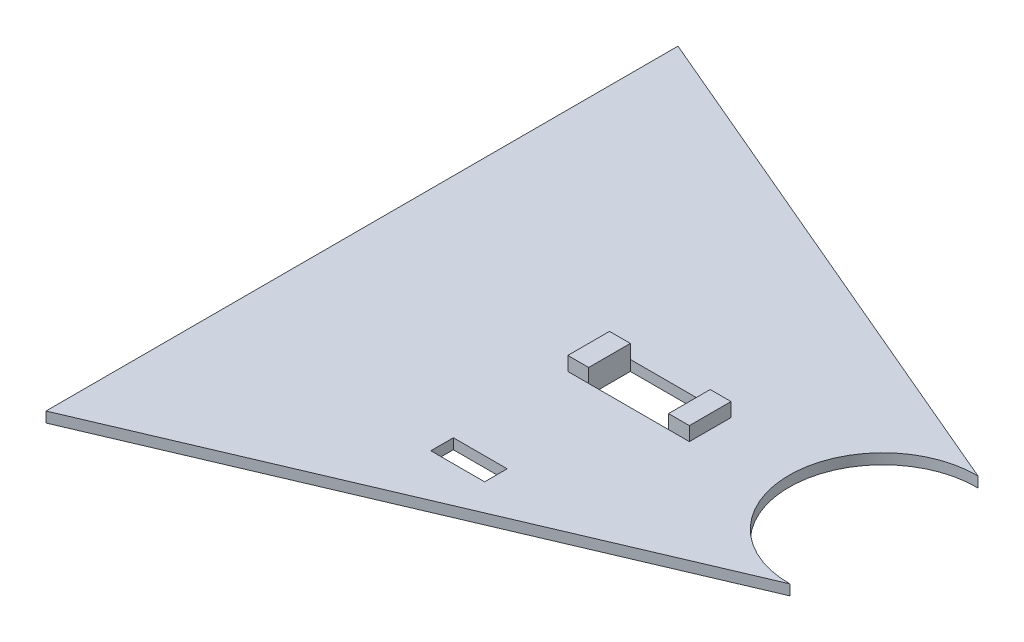
ISO-10303-21;
HEADER;
FILE_DESCRIPTION(('STEP AP214'),'2;1');
FILE_NAME('part.step','',(''),(''),'','','');
FILE_SCHEMA(('AUTOMOTIVE_DESIGN { 1 0 10303 214 1 1 1 1 }'));
ENDSEC;
DATA;
#1=APPLICATION_CONTEXT('core data for automotive mechanical design processes');
#2=APPLICATION_PROTOCOL_DEFINITION('international standard','automotive_design',2000,#1);
#3=PRODUCT_CONTEXT('',#1,'mechanical');
#4=PRODUCT('Part','Part','',(#3));
#5=PRODUCT_RELATED_PRODUCT_CATEGORY('part','',(#4));
#6=PRODUCT_DEFINITION_FORMATION('','',#4);
#7=PRODUCT_DEFINITION_CONTEXT('part definition',#1,'design');
#8=PRODUCT_DEFINITION('design','',#6,#7);
#9=PRODUCT_DEFINITION_SHAPE('','',#8);
#10=(LENGTH_UNIT() NAMED_UNIT(*) SI_UNIT(.MILLI.,.METRE.));
#11=(NAMED_UNIT(*) PLANE_ANGLE_UNIT() SI_UNIT($,.RADIAN.));
#12=(NAMED_UNIT(*) SI_UNIT($,.STERADIAN.) SOLID_ANGLE_UNIT());
#13=UNCERTAINTY_MEASURE_WITH_UNIT(LENGTH_MEASURE(1.E-05),#10,'distance_accuracy_value','');
#14=(GEOMETRIC_REPRESENTATION_CONTEXT(3) GLOBAL_UNCERTAINTY_ASSIGNED_CONTEXT((#13)) GLOBAL_UNIT_ASSIGNED_CONTEXT((#10,
#11,#12)) REPRESENTATION_CONTEXT('',''));
#15=CARTESIAN_POINT('',(0.,0.,0.));
#16=DIRECTION('',(0.,0.,1.));
#17=DIRECTION('',(1.,0.,0.));
#18=AXIS2_PLACEMENT_3D('',#15,#16,#17);
#19=CARTESIAN_POINT('',(150.,3.,0.));
#20=DIRECTION('',(0.,1.,0.));
#21=DIRECTION('',(0.,0.,1.));
#22=AXIS2_PLACEMENT_3D('',#19,#20,#21);
#23=PLANE('',#22);
#24=DIRECTION('',(0.,0.,1.));
#25=VECTOR('',#24,1.);
#26=CARTESIAN_POINT('',(65.3229716110229,3.,39.0075578283953));
#27=LINE('',#26,#25);
#28=CARTESIAN_POINT('',(65.3229716110229,3.,39.0075578283953));
#29=VERTEX_POINT('',#28);
#30=CARTESIAN_POINT('',(65.3229716110229,3.,45.5075578283953));
#31=VERTEX_POINT('',#30);
#32=EDGE_CURVE('E280',#29,#31,#27,.T.);
#33=ORIENTED_EDGE('',*,*,#32,.F.);
#34=DIRECTION('',(-1.,0.,0.));
#35=VECTOR('',#34,1.);
#36=CARTESIAN_POINT('',(65.3229716110229,3.,39.0075578283953));
#37=LINE('',#36,#35);
#38=CARTESIAN_POINT('',(80.823791534097,3.,39.0075578283953));
#39=VERTEX_POINT('',#38);
#40=EDGE_CURVE('E292',#39,#29,#37,.T.);
#41=ORIENTED_EDGE('',*,*,#40,.F.);
#42=DIRECTION('',(0.,0.,-1.));
#43=VECTOR('',#42,1.);
#44=CARTESIAN_POINT('',(80.823791534097,3.,39.0075578283953));
#45=LINE('',#44,#43);
#46=CARTESIAN_POINT('',(80.823791534097,3.,45.5075578283953));
#47=VERTEX_POINT('',#46);
#48=EDGE_CURVE('E311',#47,#39,#45,.T.);
#49=ORIENTED_EDGE('',*,*,#48,.F.);
#50=DIRECTION('',(1.,0.,0.));
#51=VECTOR('',#50,1.);
#52=CARTESIAN_POINT('',(65.3229716110229,3.,45.5075578283953));
#53=LINE('',#52,#51);
#54=EDGE_CURVE('E307',#31,#47,#53,.T.);
#55=ORIENTED_EDGE('',*,*,#54,.F.);
#56=EDGE_LOOP('',(#33,#41,#49,#55));
#57=FACE_BOUND('',#56,.T.);
#58=DIRECTION('',(0.919983270683584,0.,-0.391957627381245));
#59=VECTOR('',#58,1.);
#60=CARTESIAN_POINT('',(0.,3.,91.));
#61=LINE('',#60,#59);
#62=CARTESIAN_POINT('',(0.,3.,91.));
#63=VERTEX_POINT('',#62);
#64=CARTESIAN_POINT('',(150.219685615905,3.,26.9991062487291));
#65=VERTEX_POINT('',#64);
#66=EDGE_CURVE('E331',#63,#65,#61,.T.);
#67=ORIENTED_EDGE('',*,*,#66,.T.);
#68=CARTESIAN_POINT('',(150.,3.,0.));
#69=DIRECTION('',(0.,-1.,0.));
#70=DIRECTION('',(0.,0.,1.));
#71=AXIS2_PLACEMENT_3D('',#68,#69,#70);
#72=CIRCLE('',#71,27.);
#73=CARTESIAN_POINT('',(150.405230156953,3.,-26.9969588753973));
#74=VERTEX_POINT('',#73);
#75=EDGE_CURVE('E335',#65,#74,#72,.T.);
#76=ORIENTED_EDGE('',*,*,#75,.T.);
#77=DIRECTION('',(-0.92015283803749,0.,-0.391559388409411));
#78=VECTOR('',#77,1.);
#79=CARTESIAN_POINT('',(0.,3.,-91.));
#80=LINE('',#79,#78);
#81=CARTESIAN_POINT('',(0.,3.,-91.));
#82=VERTEX_POINT('',#81);
#83=EDGE_CURVE('E339',#74,#82,#80,.T.);
#84=ORIENTED_EDGE('',*,*,#83,.T.);
#85=DIRECTION('',(0.,0.,1.));
#86=VECTOR('',#85,1.);
#87=CARTESIAN_POINT('',(0.,3.,91.));
#88=LINE('',#87,#86);
#89=EDGE_CURVE('E342',#82,#63,#88,.T.);
#90=ORIENTED_EDGE('',*,*,#89,.T.);
#91=EDGE_LOOP('',(#67,#76,#84,#90));
#92=FACE_BOUND('',#91,.T.);
#93=DIRECTION('',(0.,0.,1.));
#94=VECTOR('',#93,1.);
#95=CARTESIAN_POINT('',(100.280547291491,3.,-6.));
#96=LINE('',#95,#94);
#97=CARTESIAN_POINT('',(100.280547291491,3.,-6.));
#98=VERTEX_POINT('',#97);
#99=CARTESIAN_POINT('',(100.280547291491,3.,6.));
#100=VERTEX_POINT('',#99);
#101=EDGE_CURVE('E55',#98,#100,#96,.T.);
#102=ORIENTED_EDGE('',*,*,#101,.T.);
#103=DIRECTION('',(1.,0.,0.));
#104=VECTOR('',#103,1.);
#105=CARTESIAN_POINT('',(94.280547291491,3.,6.));
#106=LINE('',#105,#104);
#107=CARTESIAN_POINT('',(94.280547291491,3.,6.));
#108=VERTEX_POINT('',#107);
#109=EDGE_CURVE('E192',#108,#100,#106,.T.);
#110=ORIENTED_EDGE('',*,*,#109,.F.);
#111=DIRECTION('',(1.,0.,0.));
#112=VECTOR('',#111,1.);
#113=CARTESIAN_POINT('',(71.280547291491,3.,6.));
#114=LINE('',#113,#112);
#115=CARTESIAN_POINT('',(71.280547291491,3.,6.));
#116=VERTEX_POINT('',#115);
#117=EDGE_CURVE('E183',#116,#108,#114,.T.);
#118=ORIENTED_EDGE('',*,*,#117,.F.);
#119=DIRECTION('',(-1.,0.,0.));
#120=VECTOR('',#119,1.);
#121=CARTESIAN_POINT('',(71.280547291491,3.,6.));
#122=LINE('',#121,#120);
#123=CARTESIAN_POINT('',(65.280547291491,3.,6.));
#124=VERTEX_POINT('',#123);
#125=EDGE_CURVE('E196',#116,#124,#122,.T.);
#126=ORIENTED_EDGE('',*,*,#125,.T.);
#127=DIRECTION('',(0.,0.,1.));
#128=VECTOR('',#127,1.);
#129=CARTESIAN_POINT('',(65.280547291491,3.,-6.));
#130=LINE('',#129,#128);
#131=CARTESIAN_POINT('',(65.280547291491,3.,-6.));
#132=VERTEX_POINT('',#131);
#133=EDGE_CURVE('E244',#132,#124,#130,.T.);
#134=ORIENTED_EDGE('',*,*,#133,.F.);
#135=DIRECTION('',(-1.,0.,0.));
#136=VECTOR('',#135,1.);
#137=CARTESIAN_POINT('',(71.280547291491,3.,-6.));
#138=LINE('',#137,#136);
#139=CARTESIAN_POINT('',(71.280547291491,3.,-6.));
#140=VERTEX_POINT('',#139);
#141=EDGE_CURVE('E231',#140,#132,#138,.T.);
#142=ORIENTED_EDGE('',*,*,#141,.F.);
#143=DIRECTION('',(1.,0.,0.));
#144=VECTOR('',#143,1.);
#145=CARTESIAN_POINT('',(71.280547291491,3.,-6.));
#146=LINE('',#145,#144);
#147=CARTESIAN_POINT('',(94.280547291491,3.,-6.));
#148=VERTEX_POINT('',#147);
#149=EDGE_CURVE('E188',#140,#148,#146,.T.);
#150=ORIENTED_EDGE('',*,*,#149,.T.);
#151=DIRECTION('',(1.,0.,0.));
#152=VECTOR('',#151,1.);
#153=CARTESIAN_POINT('',(94.280547291491,3.,-6.));
#154=LINE('',#153,#152);
#155=EDGE_CURVE('E60',#148,#98,#154,.T.);
#156=ORIENTED_EDGE('',*,*,#155,.T.);
#157=EDGE_LOOP('',(#102,#110,#118,#126,#134,#142,#150,#156));
#158=FACE_BOUND('',#157,.T.);
#159=ADVANCED_FACE('F39',(#57,#92,#158),#23,.T.);
#160=CARTESIAN_POINT('',(0.,3.,91.));
#161=DIRECTION('',(-0.391957627381245,0.,-0.919983270683584));
#162=DIRECTION('',(-0.919983270683584,0.,0.391957627381245));
#163=AXIS2_PLACEMENT_3D('',#160,#161,#162);
#164=PLANE('',#163);
#165=DIRECTION('',(0.919983270683584,0.,-0.391957627381245));
#166=VECTOR('',#165,1.);
#167=CARTESIAN_POINT('',(0.,0.,91.));
#168=LINE('',#167,#166);
#169=CARTESIAN_POINT('',(0.,0.,91.));
#170=VERTEX_POINT('',#169);
#171=CARTESIAN_POINT('',(150.219685615905,0.,26.9991062487291));
#172=VERTEX_POINT('',#171);
#173=EDGE_CURVE('E321',#170,#172,#168,.T.);
#174=ORIENTED_EDGE('',*,*,#173,.T.);
#175=DIRECTION('',(0.,-1.,0.));
#176=VECTOR('',#175,1.);
#177=CARTESIAN_POINT('',(150.219685615905,3.,26.9991062487291));
#178=LINE('',#177,#176);
#179=EDGE_CURVE('E11',#65,#172,#178,.T.);
#180=ORIENTED_EDGE('',*,*,#179,.F.);
#181=ORIENTED_EDGE('',*,*,#66,.F.);
#182=DIRECTION('',(0.,-1.,0.));
#183=VECTOR('',#182,1.);
#184=CARTESIAN_POINT('',(0.,3.,91.));
#185=LINE('',#184,#183);
#186=EDGE_CURVE('E345',#63,#170,#185,.T.);
#187=ORIENTED_EDGE('',*,*,#186,.T.);
#188=EDGE_LOOP('',(#174,#180,#181,#187));
#189=FACE_BOUND('',#188,.T.);
#190=ADVANCED_FACE('F41',(#189),#164,.F.);
#191=CARTESIAN_POINT('',(150.,3.,0.));
#192=DIRECTION('',(0.,-1.,0.));
#193=DIRECTION('',(0.,0.,-1.));
#194=AXIS2_PLACEMENT_3D('',#191,#192,#193);
#195=CYLINDRICAL_SURFACE('',#194,27.);
#196=CARTESIAN_POINT('',(150.,0.,0.));
#197=DIRECTION('',(0.,-1.,0.));
#198=DIRECTION('',(0.,0.,1.));
#199=AXIS2_PLACEMENT_3D('',#196,#197,#198);
#200=CIRCLE('',#199,27.);
#201=CARTESIAN_POINT('',(150.405230156953,0.,-26.9969588753973));
#202=VERTEX_POINT('',#201);
#203=EDGE_CURVE('E349',#172,#202,#200,.T.);
#204=ORIENTED_EDGE('',*,*,#203,.T.);
#205=DIRECTION('',(0.,-1.,0.));
#206=VECTOR('',#205,1.);
#207=CARTESIAN_POINT('',(150.405230156953,3.,-26.9969588753973));
#208=LINE('',#207,#206);
#209=EDGE_CURVE('E48',#74,#202,#208,.T.);
#210=ORIENTED_EDGE('',*,*,#209,.F.);
#211=ORIENTED_EDGE('',*,*,#75,.F.);
#212=ORIENTED_EDGE('',*,*,#179,.T.);
#213=EDGE_LOOP('',(#204,#210,#211,#212));
#214=FACE_BOUND('',#213,.T.);
#215=ADVANCED_FACE('F384',(#214),#195,.F.);
#216=CARTESIAN_POINT('',(0.,3.,-91.));
#217=DIRECTION('',(-0.391559388409411,0.,0.92015283803749));
#218=DIRECTION('',(0.920152838037491,0.,0.391559388409411));
#219=AXIS2_PLACEMENT_3D('',#216,#217,#218);
#220=PLANE('',#219);
#221=DIRECTION('',(-0.92015283803749,0.,-0.391559388409411));
#222=VECTOR('',#221,1.);
#223=CARTESIAN_POINT('',(0.,0.,-91.));
#224=LINE('',#223,#222);
#225=CARTESIAN_POINT('',(0.,0.,-91.));
#226=VERTEX_POINT('',#225);
#227=EDGE_CURVE('E352',#202,#226,#224,.T.);
#228=ORIENTED_EDGE('',*,*,#227,.T.);
#229=DIRECTION('',(0.,-1.,0.));
#230=VECTOR('',#229,1.);
#231=CARTESIAN_POINT('',(0.,3.,-91.));
#232=LINE('',#231,#230);
#233=EDGE_CURVE('E360',#82,#226,#232,.T.);
#234=ORIENTED_EDGE('',*,*,#233,.F.);
#235=ORIENTED_EDGE('',*,*,#83,.F.);
#236=ORIENTED_EDGE('',*,*,#209,.T.);
#237=EDGE_LOOP('',(#228,#234,#235,#236));
#238=FACE_BOUND('',#237,.T.);
#239=ADVANCED_FACE('F369',(#238),#220,.F.);
#240=CARTESIAN_POINT('',(0.,3.,91.));
#241=DIRECTION('',(1.,0.,0.));
#242=DIRECTION('',(0.,0.,-1.));
#243=AXIS2_PLACEMENT_3D('',#240,#241,#242);
#244=PLANE('',#243);
#245=DIRECTION('',(0.,0.,1.));
#246=VECTOR('',#245,1.);
#247=CARTESIAN_POINT('',(0.,0.,91.));
#248=LINE('',#247,#246);
#249=EDGE_CURVE('E336',#226,#170,#248,.T.);
#250=ORIENTED_EDGE('',*,*,#249,.T.);
#251=ORIENTED_EDGE('',*,*,#186,.F.);
#252=ORIENTED_EDGE('',*,*,#89,.F.);
#253=ORIENTED_EDGE('',*,*,#233,.T.);
#254=EDGE_LOOP('',(#250,#251,#252,#253));
#255=FACE_BOUND('',#254,.T.);
#256=ADVANCED_FACE('F378',(#255),#244,.F.);
#257=CARTESIAN_POINT('',(150.,0.,0.));
#258=DIRECTION('',(0.,1.,0.));
#259=DIRECTION('',(0.,0.,1.));
#260=AXIS2_PLACEMENT_3D('',#257,#258,#259);
#261=PLANE('',#260);
#262=DIRECTION('',(0.,0.,1.));
#263=VECTOR('',#262,1.);
#264=CARTESIAN_POINT('',(71.280547291491,0.,-6.));
#265=LINE('',#264,#263);
#266=CARTESIAN_POINT('',(71.280547291491,0.,-6.));
#267=VERTEX_POINT('',#266);
#268=CARTESIAN_POINT('',(71.280547291491,0.,6.));
#269=VERTEX_POINT('',#268);
#270=EDGE_CURVE('E180',#267,#269,#265,.T.);
#271=ORIENTED_EDGE('',*,*,#270,.T.);
#272=DIRECTION('',(1.,0.,0.));
#273=VECTOR('',#272,1.);
#274=CARTESIAN_POINT('',(71.280547291491,0.,6.));
#275=LINE('',#274,#273);
#276=CARTESIAN_POINT('',(94.280547291491,0.,6.));
#277=VERTEX_POINT('',#276);
#278=EDGE_CURVE('E264',#269,#277,#275,.T.);
#279=ORIENTED_EDGE('',*,*,#278,.T.);
#280=DIRECTION('',(0.,0.,1.));
#281=VECTOR('',#280,1.);
#282=CARTESIAN_POINT('',(94.280547291491,0.,-6.));
#283=LINE('',#282,#281);
#284=CARTESIAN_POINT('',(94.280547291491,0.,-6.));
#285=VERTEX_POINT('',#284);
#286=EDGE_CURVE('E174',#285,#277,#283,.T.);
#287=ORIENTED_EDGE('',*,*,#286,.F.);
#288=DIRECTION('',(1.,0.,0.));
#289=VECTOR('',#288,1.);
#290=CARTESIAN_POINT('',(71.280547291491,0.,-6.));
#291=LINE('',#290,#289);
#292=EDGE_CURVE('E269',#267,#285,#291,.T.);
#293=ORIENTED_EDGE('',*,*,#292,.F.);
#294=EDGE_LOOP('',(#271,#279,#287,#293));
#295=FACE_BOUND('',#294,.T.);
#296=DIRECTION('',(-1.,0.,0.));
#297=VECTOR('',#296,1.);
#298=CARTESIAN_POINT('',(65.3229716110229,0.,39.0075578283953));
#299=LINE('',#298,#297);
#300=CARTESIAN_POINT('',(80.823791534097,0.,39.0075578283953));
#301=VERTEX_POINT('',#300);
#302=CARTESIAN_POINT('',(65.3229716110229,0.,39.0075578283953));
#303=VERTEX_POINT('',#302);
#304=EDGE_CURVE('E300',#301,#303,#299,.T.);
#305=ORIENTED_EDGE('',*,*,#304,.T.);
#306=DIRECTION('',(0.,0.,1.));
#307=VECTOR('',#306,1.);
#308=CARTESIAN_POINT('',(65.3229716110229,0.,39.0075578283953));
#309=LINE('',#308,#307);
#310=CARTESIAN_POINT('',(65.3229716110229,0.,45.5075578283953));
#311=VERTEX_POINT('',#310);
#312=EDGE_CURVE('E287',#303,#311,#309,.T.);
#313=ORIENTED_EDGE('',*,*,#312,.T.);
#314=DIRECTION('',(1.,0.,0.));
#315=VECTOR('',#314,1.);
#316=CARTESIAN_POINT('',(65.3229716110229,0.,45.5075578283953));
#317=LINE('',#316,#315);
#318=CARTESIAN_POINT('',(80.823791534097,0.,45.5075578283953));
#319=VERTEX_POINT('',#318);
#320=EDGE_CURVE('E291',#311,#319,#317,.T.);
#321=ORIENTED_EDGE('',*,*,#320,.T.);
#322=DIRECTION('',(0.,0.,-1.));
#323=VECTOR('',#322,1.);
#324=CARTESIAN_POINT('',(80.823791534097,0.,39.0075578283953));
#325=LINE('',#324,#323);
#326=EDGE_CURVE('E296',#319,#301,#325,.T.);
#327=ORIENTED_EDGE('',*,*,#326,.T.);
#328=EDGE_LOOP('',(#305,#313,#321,#327));
#329=FACE_BOUND('',#328,.T.);
#330=ORIENTED_EDGE('',*,*,#173,.F.);
#331=ORIENTED_EDGE('',*,*,#249,.F.);
#332=ORIENTED_EDGE('',*,*,#227,.F.);
#333=ORIENTED_EDGE('',*,*,#203,.F.);
#334=EDGE_LOOP('',(#330,#331,#332,#333));
#335=FACE_BOUND('',#334,.T.);
#336=ADVANCED_FACE('F375',(#295,#329,#335),#261,.F.);
#337=CARTESIAN_POINT('',(65.3229716110229,0.,39.0075578283953));
#338=DIRECTION('',(-1.,0.,0.));
#339=DIRECTION('',(0.,0.,1.));
#340=AXIS2_PLACEMENT_3D('',#337,#338,#339);
#341=PLANE('',#340);
#342=ORIENTED_EDGE('',*,*,#32,.T.);
#343=DIRECTION('',(0.,1.,0.));
#344=VECTOR('',#343,1.);
#345=CARTESIAN_POINT('',(65.3229716110229,0.,45.5075578283953));
#346=LINE('',#345,#344);
#347=EDGE_CURVE('E304',#311,#31,#346,.T.);
#348=ORIENTED_EDGE('',*,*,#347,.F.);
#349=ORIENTED_EDGE('',*,*,#312,.F.);
#350=DIRECTION('',(0.,1.,0.));
#351=VECTOR('',#350,1.);
#352=CARTESIAN_POINT('',(65.3229716110229,0.,39.0075578283953));
#353=LINE('',#352,#351);
#354=EDGE_CURVE('E318',#303,#29,#353,.T.);
#355=ORIENTED_EDGE('',*,*,#354,.T.);
#356=EDGE_LOOP('',(#342,#348,#349,#355));
#357=FACE_BOUND('',#356,.T.);
#358=ADVANCED_FACE('F399',(#357),#341,.F.);
#359=CARTESIAN_POINT('',(65.3229716110229,0.,39.0075578283953));
#360=DIRECTION('',(0.,0.,-1.));
#361=DIRECTION('',(-1.,0.,0.));
#362=AXIS2_PLACEMENT_3D('',#359,#360,#361);
#363=PLANE('',#362);
#364=ORIENTED_EDGE('',*,*,#40,.T.);
#365=ORIENTED_EDGE('',*,*,#354,.F.);
#366=ORIENTED_EDGE('',*,*,#304,.F.);
#367=DIRECTION('',(0.,1.,0.));
#368=VECTOR('',#367,1.);
#369=CARTESIAN_POINT('',(80.823791534097,0.,39.0075578283953));
#370=LINE('',#369,#368);
#371=EDGE_CURVE('E322',#301,#39,#370,.T.);
#372=ORIENTED_EDGE('',*,*,#371,.T.);
#373=EDGE_LOOP('',(#364,#365,#366,#372));
#374=FACE_BOUND('',#373,.T.);
#375=ADVANCED_FACE('F420',(#374),#363,.F.);
#376=CARTESIAN_POINT('',(80.823791534097,0.,39.0075578283953));
#377=DIRECTION('',(1.,0.,0.));
#378=DIRECTION('',(0.,0.,-1.));
#379=AXIS2_PLACEMENT_3D('',#376,#377,#378);
#380=PLANE('',#379);
#381=ORIENTED_EDGE('',*,*,#48,.T.);
#382=ORIENTED_EDGE('',*,*,#371,.F.);
#383=ORIENTED_EDGE('',*,*,#326,.F.);
#384=DIRECTION('',(0.,1.,0.));
#385=VECTOR('',#384,1.);
#386=CARTESIAN_POINT('',(80.823791534097,0.,45.5075578283953));
#387=LINE('',#386,#385);
#388=EDGE_CURVE('E325',#319,#47,#387,.T.);
#389=ORIENTED_EDGE('',*,*,#388,.T.);
#390=EDGE_LOOP('',(#381,#382,#383,#389));
#391=FACE_BOUND('',#390,.T.);
#392=ADVANCED_FACE('F427',(#391),#380,.F.);
#393=CARTESIAN_POINT('',(65.3229716110229,0.,45.5075578283953));
#394=DIRECTION('',(0.,0.,1.));
#395=DIRECTION('',(1.,0.,0.));
#396=AXIS2_PLACEMENT_3D('',#393,#394,#395);
#397=PLANE('',#396);
#398=ORIENTED_EDGE('',*,*,#54,.T.);
#399=ORIENTED_EDGE('',*,*,#388,.F.);
#400=ORIENTED_EDGE('',*,*,#320,.F.);
#401=ORIENTED_EDGE('',*,*,#347,.T.);
#402=EDGE_LOOP('',(#398,#399,#400,#401));
#403=FACE_BOUND('',#402,.T.);
#404=ADVANCED_FACE('F435',(#403),#397,.F.);
#405=CARTESIAN_POINT('',(71.280547291491,0.,6.));
#406=DIRECTION('',(0.,0.,1.));
#407=DIRECTION('',(1.,0.,0.));
#408=AXIS2_PLACEMENT_3D('',#405,#406,#407);
#409=PLANE('',#408);
#410=ORIENTED_EDGE('',*,*,#117,.T.);
#411=DIRECTION('',(0.,1.,0.));
#412=VECTOR('',#411,1.);
#413=CARTESIAN_POINT('',(94.280547291491,0.,6.));
#414=LINE('',#413,#412);
#415=EDGE_CURVE('E166',#277,#108,#414,.T.);
#416=ORIENTED_EDGE('',*,*,#415,.F.);
#417=ORIENTED_EDGE('',*,*,#278,.F.);
#418=DIRECTION('',(0.,1.,0.));
#419=VECTOR('',#418,1.);
#420=CARTESIAN_POINT('',(71.280547291491,0.,6.));
#421=LINE('',#420,#419);
#422=EDGE_CURVE('E185',#269,#116,#421,.T.);
#423=ORIENTED_EDGE('',*,*,#422,.T.);
#424=EDGE_LOOP('',(#410,#416,#417,#423));
#425=FACE_BOUND('',#424,.T.);
#426=ADVANCED_FACE('F184',(#425),#409,.F.);
#427=CARTESIAN_POINT('',(71.280547291491,0.,-6.));
#428=DIRECTION('',(-1.,0.,0.));
#429=DIRECTION('',(0.,0.,1.));
#430=AXIS2_PLACEMENT_3D('',#427,#428,#429);
#431=PLANE('',#430);
#432=DIRECTION('',(0.,1.,0.));
#433=VECTOR('',#432,1.);
#434=CARTESIAN_POINT('',(71.280547291491,0.,-6.));
#435=LINE('',#434,#433);
#436=EDGE_CURVE('E281',#267,#140,#435,.T.);
#437=ORIENTED_EDGE('',*,*,#436,.T.);
#438=DIRECTION('',(0.,-1.,0.));
#439=VECTOR('',#438,1.);
#440=CARTESIAN_POINT('',(71.280547291491,7.,-6.));
#441=LINE('',#440,#439);
#442=CARTESIAN_POINT('',(71.280547291491,7.,-6.));
#443=VERTEX_POINT('',#442);
#444=EDGE_CURVE('E253',#443,#140,#441,.T.);
#445=ORIENTED_EDGE('',*,*,#444,.F.);
#446=DIRECTION('',(0.,0.,1.));
#447=VECTOR('',#446,1.);
#448=CARTESIAN_POINT('',(71.280547291491,7.,-6.));
#449=LINE('',#448,#447);
#450=CARTESIAN_POINT('',(71.280547291491,7.,6.));
#451=VERTEX_POINT('',#450);
#452=EDGE_CURVE('E237',#443,#451,#449,.T.);
#453=ORIENTED_EDGE('',*,*,#452,.T.);
#454=DIRECTION('',(0.,-1.,0.));
#455=VECTOR('',#454,1.);
#456=CARTESIAN_POINT('',(71.280547291491,7.,6.));
#457=LINE('',#456,#455);
#458=EDGE_CURVE('E189',#451,#116,#457,.T.);
#459=ORIENTED_EDGE('',*,*,#458,.T.);
#460=ORIENTED_EDGE('',*,*,#422,.F.);
#461=ORIENTED_EDGE('',*,*,#270,.F.);
#462=EDGE_LOOP('',(#437,#445,#453,#459,#460,#461));
#463=FACE_BOUND('',#462,.T.);
#464=ADVANCED_FACE('F448',(#463),#431,.F.);
#465=CARTESIAN_POINT('',(71.280547291491,0.,-6.));
#466=DIRECTION('',(0.,0.,1.));
#467=DIRECTION('',(1.,0.,0.));
#468=AXIS2_PLACEMENT_3D('',#465,#466,#467);
#469=PLANE('',#468);
#470=ORIENTED_EDGE('',*,*,#149,.F.);
#471=ORIENTED_EDGE('',*,*,#436,.F.);
#472=ORIENTED_EDGE('',*,*,#292,.T.);
#473=DIRECTION('',(0.,1.,0.));
#474=VECTOR('',#473,1.);
#475=CARTESIAN_POINT('',(94.280547291491,0.,-6.));
#476=LINE('',#475,#474);
#477=EDGE_CURVE('E179',#285,#148,#476,.T.);
#478=ORIENTED_EDGE('',*,*,#477,.T.);
#479=EDGE_LOOP('',(#470,#471,#472,#478));
#480=FACE_BOUND('',#479,.T.);
#481=ADVANCED_FACE('F455',(#480),#469,.T.);
#482=CARTESIAN_POINT('',(94.280547291491,0.,-6.));
#483=DIRECTION('',(-1.,0.,0.));
#484=DIRECTION('',(0.,0.,1.));
#485=AXIS2_PLACEMENT_3D('',#482,#483,#484);
#486=PLANE('',#485);
#487=ORIENTED_EDGE('',*,*,#415,.T.);
#488=DIRECTION('',(0.,-1.,0.));
#489=VECTOR('',#488,1.);
#490=CARTESIAN_POINT('',(94.280547291491,7.,6.));
#491=LINE('',#490,#489);
#492=CARTESIAN_POINT('',(94.280547291491,7.,6.));
#493=VERTEX_POINT('',#492);
#494=EDGE_CURVE('E171',#493,#108,#491,.T.);
#495=ORIENTED_EDGE('',*,*,#494,.F.);
#496=DIRECTION('',(0.,0.,1.));
#497=VECTOR('',#496,1.);
#498=CARTESIAN_POINT('',(94.280547291491,7.,-6.));
#499=LINE('',#498,#497);
#500=CARTESIAN_POINT('',(94.280547291491,7.,-6.));
#501=VERTEX_POINT('',#500);
#502=EDGE_CURVE('E201',#501,#493,#499,.T.);
#503=ORIENTED_EDGE('',*,*,#502,.F.);
#504=DIRECTION('',(0.,-1.,0.));
#505=VECTOR('',#504,1.);
#506=CARTESIAN_POINT('',(94.280547291491,7.,-6.));
#507=LINE('',#506,#505);
#508=EDGE_CURVE('E202',#501,#148,#507,.T.);
#509=ORIENTED_EDGE('',*,*,#508,.T.);
#510=ORIENTED_EDGE('',*,*,#477,.F.);
#511=ORIENTED_EDGE('',*,*,#286,.T.);
#512=EDGE_LOOP('',(#487,#495,#503,#509,#510,#511));
#513=FACE_BOUND('',#512,.T.);
#514=ADVANCED_FACE('F168',(#513),#486,.T.);
#515=CARTESIAN_POINT('',(71.280547291491,7.,6.));
#516=DIRECTION('',(0.,0.,1.));
#517=DIRECTION('',(1.,0.,0.));
#518=AXIS2_PLACEMENT_3D('',#515,#516,#517);
#519=PLANE('',#518);
#520=ORIENTED_EDGE('',*,*,#125,.F.);
#521=ORIENTED_EDGE('',*,*,#458,.F.);
#522=DIRECTION('',(-1.,0.,0.));
#523=VECTOR('',#522,1.);
#524=CARTESIAN_POINT('',(71.280547291491,7.,6.));
#525=LINE('',#524,#523);
#526=CARTESIAN_POINT('',(65.280547291491,7.,6.));
#527=VERTEX_POINT('',#526);
#528=EDGE_CURVE('E226',#451,#527,#525,.T.);
#529=ORIENTED_EDGE('',*,*,#528,.T.);
#530=DIRECTION('',(0.,-1.,0.));
#531=VECTOR('',#530,1.);
#532=CARTESIAN_POINT('',(65.280547291491,7.,6.));
#533=LINE('',#532,#531);
#534=EDGE_CURVE('E241',#527,#124,#533,.T.);
#535=ORIENTED_EDGE('',*,*,#534,.T.);
#536=EDGE_LOOP('',(#520,#521,#529,#535));
#537=FACE_BOUND('',#536,.T.);
#538=ADVANCED_FACE('F470',(#537),#519,.T.);
#539=CARTESIAN_POINT('',(71.280547291491,7.,-6.));
#540=DIRECTION('',(0.,0.,1.));
#541=DIRECTION('',(1.,0.,0.));
#542=AXIS2_PLACEMENT_3D('',#539,#540,#541);
#543=PLANE('',#542);
#544=ORIENTED_EDGE('',*,*,#141,.T.);
#545=DIRECTION('',(0.,-1.,0.));
#546=VECTOR('',#545,1.);
#547=CARTESIAN_POINT('',(65.280547291491,7.,-6.));
#548=LINE('',#547,#546);
#549=CARTESIAN_POINT('',(65.280547291491,7.,-6.));
#550=VERTEX_POINT('',#549);
#551=EDGE_CURVE('E257',#550,#132,#548,.T.);
#552=ORIENTED_EDGE('',*,*,#551,.F.);
#553=DIRECTION('',(-1.,0.,0.));
#554=VECTOR('',#553,1.);
#555=CARTESIAN_POINT('',(71.280547291491,7.,-6.));
#556=LINE('',#555,#554);
#557=EDGE_CURVE('E234',#443,#550,#556,.T.);
#558=ORIENTED_EDGE('',*,*,#557,.F.);
#559=ORIENTED_EDGE('',*,*,#444,.T.);
#560=EDGE_LOOP('',(#544,#552,#558,#559));
#561=FACE_BOUND('',#560,.T.);
#562=ADVANCED_FACE('F477',(#561),#543,.F.);
#563=CARTESIAN_POINT('',(65.280547291491,7.,-6.));
#564=DIRECTION('',(1.,0.,0.));
#565=DIRECTION('',(0.,0.,-1.));
#566=AXIS2_PLACEMENT_3D('',#563,#564,#565);
#567=PLANE('',#566);
#568=ORIENTED_EDGE('',*,*,#133,.T.);
#569=ORIENTED_EDGE('',*,*,#534,.F.);
#570=DIRECTION('',(0.,0.,1.));
#571=VECTOR('',#570,1.);
#572=CARTESIAN_POINT('',(65.280547291491,7.,-6.));
#573=LINE('',#572,#571);
#574=EDGE_CURVE('E230',#550,#527,#573,.T.);
#575=ORIENTED_EDGE('',*,*,#574,.F.);
#576=ORIENTED_EDGE('',*,*,#551,.T.);
#577=EDGE_LOOP('',(#568,#569,#575,#576));
#578=FACE_BOUND('',#577,.T.);
#579=ADVANCED_FACE('F485',(#578),#567,.F.);
#580=CARTESIAN_POINT('',(0.,7.,0.));
#581=DIRECTION('',(0.,1.,0.));
#582=DIRECTION('',(0.,0.,1.));
#583=AXIS2_PLACEMENT_3D('',#580,#581,#582);
#584=PLANE('',#583);
#585=ORIENTED_EDGE('',*,*,#528,.F.);
#586=ORIENTED_EDGE('',*,*,#452,.F.);
#587=ORIENTED_EDGE('',*,*,#557,.T.);
#588=ORIENTED_EDGE('',*,*,#574,.T.);
#589=EDGE_LOOP('',(#585,#586,#587,#588));
#590=FACE_BOUND('',#589,.T.);
#591=ADVANCED_FACE('F493',(#590),#584,.T.);
#592=CARTESIAN_POINT('',(94.280547291491,7.,6.));
#593=DIRECTION('',(0.,0.,-1.));
#594=DIRECTION('',(-1.,0.,0.));
#595=AXIS2_PLACEMENT_3D('',#592,#593,#594);
#596=PLANE('',#595);
#597=ORIENTED_EDGE('',*,*,#109,.T.);
#598=DIRECTION('',(0.,-1.,0.));
#599=VECTOR('',#598,1.);
#600=CARTESIAN_POINT('',(100.280547291491,7.,6.));
#601=LINE('',#600,#599);
#602=CARTESIAN_POINT('',(100.280547291491,7.,6.));
#603=VERTEX_POINT('',#602);
#604=EDGE_CURVE('E596',#603,#100,#601,.T.);
#605=ORIENTED_EDGE('',*,*,#604,.F.);
#606=DIRECTION('',(1.,0.,0.));
#607=VECTOR('',#606,1.);
#608=CARTESIAN_POINT('',(94.280547291491,7.,6.));
#609=LINE('',#608,#607);
#610=EDGE_CURVE('E199',#493,#603,#609,.T.);
#611=ORIENTED_EDGE('',*,*,#610,.F.);
#612=ORIENTED_EDGE('',*,*,#494,.T.);
#613=EDGE_LOOP('',(#597,#605,#611,#612));
#614=FACE_BOUND('',#613,.T.);
#615=ADVANCED_FACE('F198',(#614),#596,.F.);
#616=CARTESIAN_POINT('',(100.280547291491,7.,-6.));
#617=DIRECTION('',(1.,0.,0.));
#618=DIRECTION('',(0.,0.,-1.));
#619=AXIS2_PLACEMENT_3D('',#616,#617,#618);
#620=PLANE('',#619);
#621=ORIENTED_EDGE('',*,*,#101,.F.);
#622=DIRECTION('',(0.,-1.,0.));
#623=VECTOR('',#622,1.);
#624=CARTESIAN_POINT('',(100.280547291491,7.,-6.));
#625=LINE('',#624,#623);
#626=CARTESIAN_POINT('',(100.280547291491,7.,-6.));
#627=VERTEX_POINT('',#626);
#628=EDGE_CURVE('E209',#627,#98,#625,.T.);
#629=ORIENTED_EDGE('',*,*,#628,.F.);
#630=DIRECTION('',(0.,0.,1.));
#631=VECTOR('',#630,1.);
#632=CARTESIAN_POINT('',(100.280547291491,7.,-6.));
#633=LINE('',#632,#631);
#634=EDGE_CURVE('E220',#627,#603,#633,.T.);
#635=ORIENTED_EDGE('',*,*,#634,.T.);
#636=ORIENTED_EDGE('',*,*,#604,.T.);
#637=EDGE_LOOP('',(#621,#629,#635,#636));
#638=FACE_BOUND('',#637,.T.);
#639=ADVANCED_FACE('F508',(#638),#620,.T.);
#640=CARTESIAN_POINT('',(94.280547291491,7.,-6.));
#641=DIRECTION('',(0.,0.,-1.));
#642=DIRECTION('',(-1.,0.,0.));
#643=AXIS2_PLACEMENT_3D('',#640,#641,#642);
#644=PLANE('',#643);
#645=ORIENTED_EDGE('',*,*,#155,.F.);
#646=ORIENTED_EDGE('',*,*,#508,.F.);
#647=DIRECTION('',(1.,0.,0.));
#648=VECTOR('',#647,1.);
#649=CARTESIAN_POINT('',(94.280547291491,7.,-6.));
#650=LINE('',#649,#648);
#651=EDGE_CURVE('E206',#501,#627,#650,.T.);
#652=ORIENTED_EDGE('',*,*,#651,.T.);
#653=ORIENTED_EDGE('',*,*,#628,.T.);
#654=EDGE_LOOP('',(#645,#646,#652,#653));
#655=FACE_BOUND('',#654,.T.);
#656=ADVANCED_FACE('F515',(#655),#644,.T.);
#657=CARTESIAN_POINT('',(0.,7.,0.));
#658=DIRECTION('',(0.,-1.,0.));
#659=DIRECTION('',(0.,0.,-1.));
#660=AXIS2_PLACEMENT_3D('',#657,#658,#659);
#661=PLANE('',#660);
#662=ORIENTED_EDGE('',*,*,#610,.T.);
#663=ORIENTED_EDGE('',*,*,#634,.F.);
#664=ORIENTED_EDGE('',*,*,#651,.F.);
#665=ORIENTED_EDGE('',*,*,#502,.T.);
#666=EDGE_LOOP('',(#662,#663,#664,#665));
#667=FACE_BOUND('',#666,.T.);
#668=ADVANCED_FACE('F523',(#667),#661,.F.);
#669=CLOSED_SHELL('',(#159,#190,#215,#239,#256,#336,#358,#375,#392,#404,#426,#464,#481,#514,
#538,#562,#579,#591,#615,#639,#656,#668));
#670=MANIFOLD_SOLID_BREP('B2',#669);
#671=ADVANCED_BREP_SHAPE_REPRESENTATION('',(#18,#670),#14);
#672=SHAPE_DEFINITION_REPRESENTATION(#9,#671);
ENDSEC;
END-ISO-10303-21;
